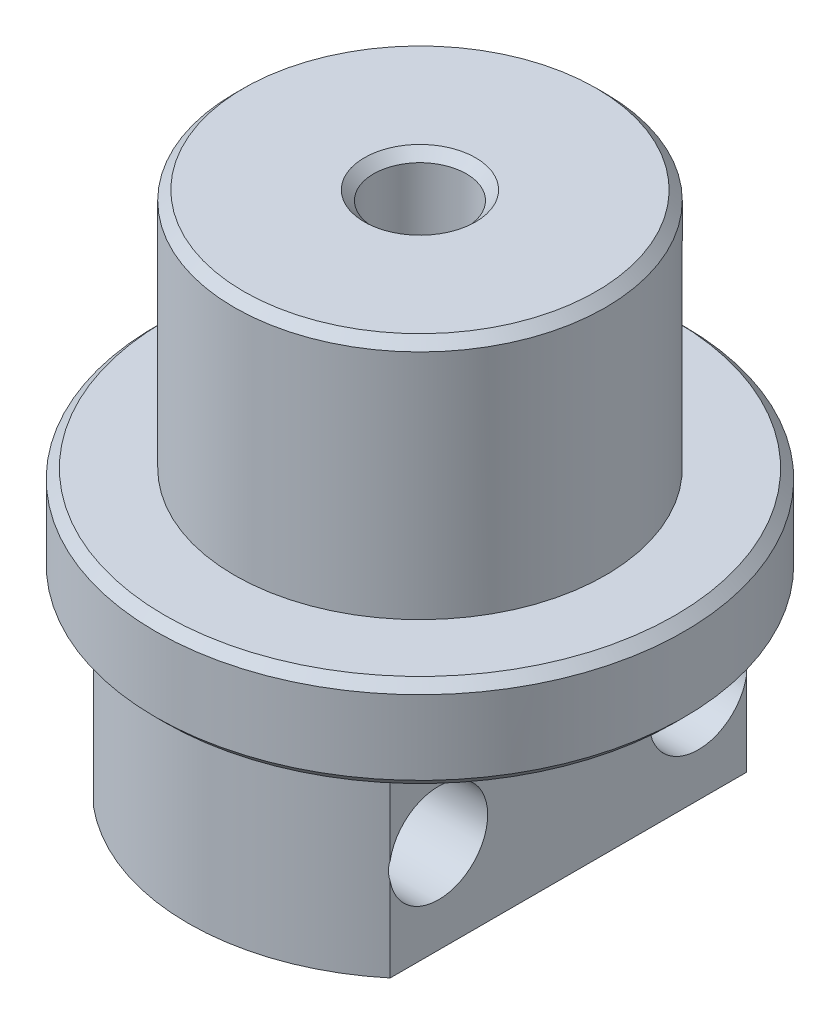
ISO-10303-21;
HEADER;
FILE_DESCRIPTION(('STEP AP214'),'2;1');
FILE_NAME('part.step','',(''),(''),'','','');
FILE_SCHEMA(('AUTOMOTIVE_DESIGN { 1 0 10303 214 1 1 1 1 }'));
ENDSEC;
DATA;
#1=APPLICATION_CONTEXT('core data for automotive mechanical design processes');
#2=APPLICATION_PROTOCOL_DEFINITION('international standard','automotive_design',2000,#1);
#3=PRODUCT_CONTEXT('',#1,'mechanical');
#4=PRODUCT('Part','Part','',(#3));
#5=PRODUCT_RELATED_PRODUCT_CATEGORY('part','',(#4));
#6=PRODUCT_DEFINITION_FORMATION('','',#4);
#7=PRODUCT_DEFINITION_CONTEXT('part definition',#1,'design');
#8=PRODUCT_DEFINITION('design','',#6,#7);
#9=PRODUCT_DEFINITION_SHAPE('','',#8);
#10=(LENGTH_UNIT() NAMED_UNIT(*) SI_UNIT(.MILLI.,.METRE.));
#11=(NAMED_UNIT(*) PLANE_ANGLE_UNIT() SI_UNIT($,.RADIAN.));
#12=(NAMED_UNIT(*) SI_UNIT($,.STERADIAN.) SOLID_ANGLE_UNIT());
#13=UNCERTAINTY_MEASURE_WITH_UNIT(LENGTH_MEASURE(1.E-05),#10,'distance_accuracy_value','');
#14=(GEOMETRIC_REPRESENTATION_CONTEXT(3) GLOBAL_UNCERTAINTY_ASSIGNED_CONTEXT((#13)) GLOBAL_UNIT_ASSIGNED_CONTEXT((#10,
#11,#12)) REPRESENTATION_CONTEXT('',''));
#15=CARTESIAN_POINT('',(0.,0.,0.));
#16=DIRECTION('',(0.,0.,1.));
#17=DIRECTION('',(1.,0.,0.));
#18=AXIS2_PLACEMENT_3D('',#15,#16,#17);
#19=CARTESIAN_POINT('',(0.,0.,0.));
#20=DIRECTION('',(0.,1.,0.));
#21=DIRECTION('',(0.,0.,1.));
#22=AXIS2_PLACEMENT_3D('',#19,#20,#21);
#23=CYLINDRICAL_SURFACE('',#22,12.5);
#24=DIRECTION('',(0.,-1.,0.));
#25=VECTOR('',#24,1.);
#26=CARTESIAN_POINT('',(7.99999999999995,29.729419656949,9.60468635614932));
#27=LINE('',#26,#25);
#28=CARTESIAN_POINT('',(7.99999999999995,4.51203587610476,9.60468635614932));
#29=VERTEX_POINT('',#28);
#30=CARTESIAN_POINT('',(7.99999999999995,0.,9.60468635614932));
#31=VERTEX_POINT('',#30);
#32=EDGE_CURVE('E248',#29,#31,#27,.T.);
#33=ORIENTED_EDGE('',*,*,#32,.F.);
#34=CARTESIAN_POINT('',(7.99999999999995,4.51203587610476,9.60468635614932));
#35=CARTESIAN_POINT('',(7.98932552687652,4.55943695181005,9.61357515241068));
#36=CARTESIAN_POINT('',(7.98011875165914,4.60741608335441,9.62121570568237));
#37=CARTESIAN_POINT('',(7.96481090833997,4.70423038441509,9.63389318043032));
#38=CARTESIAN_POINT('',(7.95871144080061,4.75306598172428,9.63892876011513));
#39=CARTESIAN_POINT('',(7.94990704324458,4.85006296771122,9.64619136002725));
#40=CARTESIAN_POINT('',(7.94712399407921,4.89821231990115,9.64848302052576));
#41=CARTESIAN_POINT('',(7.94475527570194,4.99461847220165,9.65043335545134));
#42=CARTESIAN_POINT('',(7.94516816785371,5.04287521419252,9.65009321457012));
#43=CARTESIAN_POINT('',(7.94996438221906,5.15763425320831,9.64614399084281));
#44=CARTESIAN_POINT('',(7.9558090875406,5.22403932634691,9.64133174835942));
#45=CARTESIAN_POINT('',(7.97343161448776,5.35667710055973,9.62675816973986));
#46=CARTESIAN_POINT('',(7.98530879648151,5.42288760112959,9.61691393410233));
#47=CARTESIAN_POINT('',(7.99999999999994,5.48796412389522,9.60468635614932));
#48=B_SPLINE_CURVE_WITH_KNOTS('',3,(#34,#35,#36,#37,#38,#39,#40,#41,#42,#43,#44,#45,#46,#47),
.UNSPECIFIED.,.F.,.F.,(4,2,2,2,2,2,4),(0.,0.148162666375663,0.296401573810314,0.441074930711813,
0.585683167443805,0.785726822426951,0.989177726164951),.UNSPECIFIED.);
#49=CARTESIAN_POINT('',(7.99999999999995,5.48796412389522,9.60468635614932));
#50=VERTEX_POINT('',#49);
#51=EDGE_CURVE('E103',#29,#50,#48,.T.);
#52=ORIENTED_EDGE('',*,*,#51,.T.);
#53=CARTESIAN_POINT('',(7.99999999999995,10.,9.60468635614932));
#54=VERTEX_POINT('',#53);
#55=EDGE_CURVE('E133',#54,#50,#27,.T.);
#56=ORIENTED_EDGE('',*,*,#55,.F.);
#57=CARTESIAN_POINT('',(0.,10.,0.));
#58=DIRECTION('',(0.,1.,0.));
#59=DIRECTION('',(0.,0.,1.));
#60=AXIS2_PLACEMENT_3D('',#57,#58,#59);
#61=CIRCLE('',#60,12.5);
#62=CARTESIAN_POINT('',(-7.99999999999995,10.,9.60468635614932));
#63=VERTEX_POINT('',#62);
#64=EDGE_CURVE('E118',#63,#54,#61,.T.);
#65=ORIENTED_EDGE('',*,*,#64,.F.);
#66=DIRECTION('',(0.,-1.,0.));
#67=VECTOR('',#66,1.);
#68=CARTESIAN_POINT('',(-7.99999999999995,29.729419656949,9.60468635614932));
#69=LINE('',#68,#67);
#70=CARTESIAN_POINT('',(-7.99999999999995,5.48796412408287,9.60468635614932));
#71=VERTEX_POINT('',#70);
#72=EDGE_CURVE('E108',#63,#71,#69,.T.);
#73=ORIENTED_EDGE('',*,*,#72,.T.);
#74=CARTESIAN_POINT('',(-7.99999999999995,5.48796412408287,9.60468635614932));
#75=CARTESIAN_POINT('',(-7.98932552687238,5.44056304837779,9.61357515241412));
#76=CARTESIAN_POINT('',(-7.98011875165078,5.39258391683344,9.62121570568931));
#77=CARTESIAN_POINT('',(-7.96481090832309,5.29576961577231,9.63389318044429));
#78=CARTESIAN_POINT('',(-7.95871144077943,5.24693401846268,9.63892876013262));
#79=CARTESIAN_POINT('',(-7.94990704321498,5.14993703247484,9.64619136005164));
#80=CARTESIAN_POINT('',(-7.94712399404546,5.10178768028448,9.64848302055356));
#81=CARTESIAN_POINT('',(-7.94475527565997,5.00538152798265,9.65043335548589));
#82=CARTESIAN_POINT('',(-7.94516816780767,4.95712478599088,9.65009321460802));
#83=CARTESIAN_POINT('',(-7.94996438216611,4.84236574691198,9.64614399088645));
#84=CARTESIAN_POINT('',(-7.95580908749047,4.77596067371131,9.64133174840081));
#85=CARTESIAN_POINT('',(-7.97343161445428,4.64332289937422,9.6267581697676));
#86=CARTESIAN_POINT('',(-7.98530879646218,4.57711239874224,9.61691393411841));
#87=CARTESIAN_POINT('',(-7.99999999999995,4.51203587591711,9.60468635614932));
#88=B_SPLINE_CURVE_WITH_KNOTS('',3,(#74,#75,#76,#77,#78,#79,#80,#81,#82,#83,#84,#85,#86,#87),
.UNSPECIFIED.,.F.,.F.,(4,2,2,2,2,2,4),(0.,0.148162666379635,0.296401573818273,0.441074930722263,
0.585683167456781,0.785726822624845,0.989177726555372),.UNSPECIFIED.);
#89=CARTESIAN_POINT('',(-7.99999999999995,4.51203587591714,9.60468635614932));
#90=VERTEX_POINT('',#89);
#91=EDGE_CURVE('E98',#71,#90,#88,.T.);
#92=ORIENTED_EDGE('',*,*,#91,.T.);
#93=CARTESIAN_POINT('',(-7.99999999999995,0.,9.60468635614932));
#94=VERTEX_POINT('',#93);
#95=EDGE_CURVE('E111',#90,#94,#69,.T.);
#96=ORIENTED_EDGE('',*,*,#95,.T.);
#97=CARTESIAN_POINT('',(0.,0.,0.));
#98=DIRECTION('',(0.,1.,0.));
#99=DIRECTION('',(0.,0.,1.));
#100=AXIS2_PLACEMENT_3D('',#97,#98,#99);
#101=CIRCLE('',#100,12.5);
#102=EDGE_CURVE('E129',#94,#31,#101,.T.);
#103=ORIENTED_EDGE('',*,*,#102,.T.);
#104=EDGE_LOOP('',(#33,#52,#56,#65,#73,#92,#96,#103));
#105=FACE_BOUND('',#104,.T.);
#106=ADVANCED_FACE('F35',(#105),#23,.T.);
#107=CARTESIAN_POINT('',(12.5,0.,0.));
#108=DIRECTION('',(0.,1.,0.));
#109=DIRECTION('',(0.,0.,1.));
#110=AXIS2_PLACEMENT_3D('',#107,#108,#109);
#111=PLANE('',#110);
#112=CARTESIAN_POINT('',(0.,0.,0.));
#113=DIRECTION('',(0.,1.,0.));
#114=DIRECTION('',(0.,0.,1.));
#115=AXIS2_PLACEMENT_3D('',#112,#113,#114);
#116=CIRCLE('',#115,2.49999999999999);
#117=CARTESIAN_POINT('',(0.,0.,2.49999999999999));
#118=VERTEX_POINT('',#117);
#119=EDGE_CURVE('E112',#118,#118,#116,.T.);
#120=ORIENTED_EDGE('',*,*,#119,.T.);
#121=EDGE_LOOP('',(#120));
#122=FACE_BOUND('',#121,.T.);
#123=CARTESIAN_POINT('',(7.99999999999995,0.,-9.60468635614932));
#124=VERTEX_POINT('',#123);
#125=CARTESIAN_POINT('',(-7.99999999999995,0.,-9.60468635614932));
#126=VERTEX_POINT('',#125);
#127=EDGE_CURVE('E132',#124,#126,#101,.T.);
#128=ORIENTED_EDGE('',*,*,#127,.F.);
#129=DIRECTION('',(0.,0.,-1.));
#130=VECTOR('',#129,1.);
#131=CARTESIAN_POINT('',(7.99999999999995,0.,9.60468635614932));
#132=LINE('',#131,#130);
#133=EDGE_CURVE('E128',#31,#124,#132,.T.);
#134=ORIENTED_EDGE('',*,*,#133,.F.);
#135=ORIENTED_EDGE('',*,*,#102,.F.);
#136=DIRECTION('',(0.,0.,1.));
#137=VECTOR('',#136,1.);
#138=CARTESIAN_POINT('',(-7.99999999999995,0.,9.60468635614932));
#139=LINE('',#138,#137);
#140=EDGE_CURVE('E255',#126,#94,#139,.T.);
#141=ORIENTED_EDGE('',*,*,#140,.F.);
#142=EDGE_LOOP('',(#128,#134,#135,#141));
#143=FACE_BOUND('',#142,.T.);
#144=ADVANCED_FACE('F175',(#122,#143),#111,.F.);
#145=CARTESIAN_POINT('',(0.,28.,0.));
#146=DIRECTION('',(0.,-1.,0.));
#147=DIRECTION('',(0.,0.,-1.));
#148=AXIS2_PLACEMENT_3D('',#145,#146,#147);
#149=PLANE('',#148);
#150=CARTESIAN_POINT('',(0.,28.,0.));
#151=DIRECTION('',(0.,-1.,0.));
#152=DIRECTION('',(0.,0.,-1.));
#153=AXIS2_PLACEMENT_3D('',#150,#151,#152);
#154=CIRCLE('',#153,9.49999999999998);
#155=CARTESIAN_POINT('',(0.,28.,-9.49999999999998));
#156=VERTEX_POINT('',#155);
#157=EDGE_CURVE('E221',#156,#156,#154,.F.);
#158=ORIENTED_EDGE('',*,*,#157,.T.);
#159=EDGE_LOOP('',(#158));
#160=FACE_BOUND('',#159,.T.);
#161=CARTESIAN_POINT('',(0.,28.,0.));
#162=DIRECTION('',(0.,-1.,0.));
#163=DIRECTION('',(0.,0.,-1.));
#164=AXIS2_PLACEMENT_3D('',#161,#162,#163);
#165=CIRCLE('',#164,3.);
#166=CARTESIAN_POINT('',(0.,28.,-3.));
#167=VERTEX_POINT('',#166);
#168=EDGE_CURVE('E222',#167,#167,#165,.T.);
#169=ORIENTED_EDGE('',*,*,#168,.T.);
#170=EDGE_LOOP('',(#169));
#171=FACE_BOUND('',#170,.T.);
#172=ADVANCED_FACE('F179',(#160,#171),#149,.F.);
#173=CARTESIAN_POINT('',(0.,0.,0.));
#174=DIRECTION('',(0.,1.,0.));
#175=DIRECTION('',(0.,0.,1.));
#176=AXIS2_PLACEMENT_3D('',#173,#174,#175);
#177=CYLINDRICAL_SURFACE('',#176,10.);
#178=CARTESIAN_POINT('',(0.,27.5,0.));
#179=DIRECTION('',(0.,-1.,0.));
#180=DIRECTION('',(0.,0.,-1.));
#181=AXIS2_PLACEMENT_3D('',#178,#179,#180);
#182=CIRCLE('',#181,10.);
#183=CARTESIAN_POINT('',(0.,27.5,-10.));
#184=VERTEX_POINT('',#183);
#185=EDGE_CURVE('E44',#184,#184,#182,.T.);
#186=ORIENTED_EDGE('',*,*,#185,.T.);
#187=EDGE_LOOP('',(#186));
#188=FACE_BOUND('',#187,.T.);
#189=CARTESIAN_POINT('',(0.,15.,0.));
#190=DIRECTION('',(0.,1.,0.));
#191=DIRECTION('',(0.,0.,1.));
#192=AXIS2_PLACEMENT_3D('',#189,#190,#191);
#193=CIRCLE('',#192,10.);
#194=CARTESIAN_POINT('',(0.,15.,10.));
#195=VERTEX_POINT('',#194);
#196=EDGE_CURVE('E136',#195,#195,#193,.T.);
#197=ORIENTED_EDGE('',*,*,#196,.T.);
#198=EDGE_LOOP('',(#197));
#199=FACE_BOUND('',#198,.T.);
#200=ADVANCED_FACE('F185',(#188,#199),#177,.T.);
#201=CARTESIAN_POINT('',(10.,15.,0.));
#202=DIRECTION('',(0.,-1.,0.));
#203=DIRECTION('',(0.,0.,-1.));
#204=AXIS2_PLACEMENT_3D('',#201,#202,#203);
#205=PLANE('',#204);
#206=CARTESIAN_POINT('',(0.,15.,0.));
#207=DIRECTION('',(0.,-1.,0.));
#208=DIRECTION('',(0.,0.,-1.));
#209=AXIS2_PLACEMENT_3D('',#206,#207,#208);
#210=CIRCLE('',#209,13.75);
#211=CARTESIAN_POINT('',(0.,15.,-13.75));
#212=VERTEX_POINT('',#211);
#213=EDGE_CURVE('E225',#212,#212,#210,.F.);
#214=ORIENTED_EDGE('',*,*,#213,.T.);
#215=EDGE_LOOP('',(#214));
#216=FACE_BOUND('',#215,.T.);
#217=ORIENTED_EDGE('',*,*,#196,.F.);
#218=EDGE_LOOP('',(#217));
#219=FACE_BOUND('',#218,.T.);
#220=ADVANCED_FACE('F284',(#216,#219),#205,.F.);
#221=CARTESIAN_POINT('',(0.,0.,0.));
#222=DIRECTION('',(0.,1.,0.));
#223=DIRECTION('',(0.,0.,1.));
#224=AXIS2_PLACEMENT_3D('',#221,#222,#223);
#225=CYLINDRICAL_SURFACE('',#224,14.25);
#226=CARTESIAN_POINT('',(0.,10.5,0.));
#227=DIRECTION('',(0.,1.,0.));
#228=DIRECTION('',(0.,0.,1.));
#229=AXIS2_PLACEMENT_3D('',#226,#227,#228);
#230=CIRCLE('',#229,14.25);
#231=CARTESIAN_POINT('',(0.,10.5,14.25));
#232=VERTEX_POINT('',#231);
#233=EDGE_CURVE('E233',#232,#232,#230,.T.);
#234=ORIENTED_EDGE('',*,*,#233,.T.);
#235=EDGE_LOOP('',(#234));
#236=FACE_BOUND('',#235,.T.);
#237=CARTESIAN_POINT('',(0.,14.5,0.));
#238=DIRECTION('',(0.,-1.,0.));
#239=DIRECTION('',(0.,0.,-1.));
#240=AXIS2_PLACEMENT_3D('',#237,#238,#239);
#241=CIRCLE('',#240,14.25);
#242=CARTESIAN_POINT('',(0.,14.5,-14.25));
#243=VERTEX_POINT('',#242);
#244=EDGE_CURVE('E236',#243,#243,#241,.T.);
#245=ORIENTED_EDGE('',*,*,#244,.T.);
#246=EDGE_LOOP('',(#245));
#247=FACE_BOUND('',#246,.T.);
#248=ADVANCED_FACE('F279',(#236,#247),#225,.T.);
#249=CARTESIAN_POINT('',(14.25,10.,0.));
#250=DIRECTION('',(0.,1.,0.));
#251=DIRECTION('',(0.,0.,1.));
#252=AXIS2_PLACEMENT_3D('',#249,#250,#251);
#253=PLANE('',#252);
#254=CARTESIAN_POINT('',(0.,10.,0.));
#255=DIRECTION('',(0.,1.,0.));
#256=DIRECTION('',(0.,0.,1.));
#257=AXIS2_PLACEMENT_3D('',#254,#255,#256);
#258=CIRCLE('',#257,13.75);
#259=CARTESIAN_POINT('',(0.,10.,13.75));
#260=VERTEX_POINT('',#259);
#261=EDGE_CURVE('E230',#260,#260,#258,.F.);
#262=ORIENTED_EDGE('',*,*,#261,.T.);
#263=EDGE_LOOP('',(#262));
#264=FACE_BOUND('',#263,.T.);
#265=ORIENTED_EDGE('',*,*,#64,.T.);
#266=DIRECTION('',(0.,0.,-1.));
#267=VECTOR('',#266,1.);
#268=CARTESIAN_POINT('',(7.99999999999995,10.,9.60468635614932));
#269=LINE('',#268,#267);
#270=CARTESIAN_POINT('',(7.99999999999995,10.,-9.60468635614932));
#271=VERTEX_POINT('',#270);
#272=EDGE_CURVE('E250',#54,#271,#269,.T.);
#273=ORIENTED_EDGE('',*,*,#272,.T.);
#274=CARTESIAN_POINT('',(-7.99999999999995,10.,-9.60468635614932));
#275=VERTEX_POINT('',#274);
#276=EDGE_CURVE('E135',#271,#275,#61,.T.);
#277=ORIENTED_EDGE('',*,*,#276,.T.);
#278=DIRECTION('',(0.,0.,1.));
#279=VECTOR('',#278,1.);
#280=CARTESIAN_POINT('',(-7.99999999999995,10.,9.60468635614932));
#281=LINE('',#280,#279);
#282=EDGE_CURVE('E123',#275,#63,#281,.T.);
#283=ORIENTED_EDGE('',*,*,#282,.T.);
#284=EDGE_LOOP('',(#265,#273,#277,#283));
#285=FACE_BOUND('',#284,.T.);
#286=ADVANCED_FACE('F172',(#264,#285),#253,.F.);
#287=DIRECTION('',(0.,-1.,0.));
#288=VECTOR('',#287,1.);
#289=CARTESIAN_POINT('',(-7.99999999999995,29.729419656949,-9.60468635614932));
#290=LINE('',#289,#288);
#291=CARTESIAN_POINT('',(-7.99999999999994,4.51203587653688,-9.60468635614932));
#292=VERTEX_POINT('',#291);
#293=EDGE_CURVE('E119',#292,#126,#290,.T.);
#294=ORIENTED_EDGE('',*,*,#293,.F.);
#295=CARTESIAN_POINT('',(-7.99999999999994,4.51203587653688,-9.60468635614932));
#296=CARTESIAN_POINT('',(-7.98932552688604,4.5594369522432,-9.61357515240274));
#297=CARTESIAN_POINT('',(-7.98011875167843,4.60741608378813,-9.62121570566637));
#298=CARTESIAN_POINT('',(-7.96481090837897,4.70423038484894,-9.63389318039807));
#299=CARTESIAN_POINT('',(-7.95871144084956,4.75306598215767,-9.6389287600747));
#300=CARTESIAN_POINT('',(-7.94990704331306,4.85006296814368,-9.6461913599708));
#301=CARTESIAN_POINT('',(-7.94712399415734,4.89821232033317,-9.6484830204614));
#302=CARTESIAN_POINT('',(-7.94475527579924,4.99461847263171,-9.65043335537124));
#303=CARTESIAN_POINT('',(-7.94516816796052,5.04287521462108,-9.65009321448219));
#304=CARTESIAN_POINT('',(-7.94996438234205,5.15763425349094,-9.64614399074144));
#305=CARTESIAN_POINT('',(-7.95580908765709,5.22403932648547,-9.64133174826324));
#306=CARTESIAN_POINT('',(-7.9734316145656,5.35667710040988,-9.62675816967538));
#307=CARTESIAN_POINT('',(-7.98530879652648,5.42288760083554,-9.61691393406497));
#308=CARTESIAN_POINT('',(-7.99999999999994,5.48796412346313,-9.60468635614932));
#309=B_SPLINE_CURVE_WITH_KNOTS('',3,(#295,#296,#297,#298,#299,#300,#301,#302,#303,#304,#305,
#306,#307,#308),.UNSPECIFIED.,.F.,.F.,(4,2,2,2,2,2,4),(0.,0.148162666368151,0.296401573795262,
0.441074930692675,0.585683167420496,0.785726821974484,0.989177725265608),.UNSPECIFIED.);
#310=CARTESIAN_POINT('',(-7.99999999999995,5.48796412346314,-9.60468635614932));
#311=VERTEX_POINT('',#310);
#312=EDGE_CURVE('E104',#292,#311,#309,.T.);
#313=ORIENTED_EDGE('',*,*,#312,.T.);
#314=EDGE_CURVE('E121',#275,#311,#290,.T.);
#315=ORIENTED_EDGE('',*,*,#314,.F.);
#316=ORIENTED_EDGE('',*,*,#276,.F.);
#317=DIRECTION('',(0.,-1.,0.));
#318=VECTOR('',#317,1.);
#319=CARTESIAN_POINT('',(7.99999999999995,29.729419656949,-9.60468635614932));
#320=LINE('',#319,#318);
#321=CARTESIAN_POINT('',(7.99999999999994,5.48796412365077,-9.60468635614932));
#322=VERTEX_POINT('',#321);
#323=EDGE_CURVE('E252',#271,#322,#320,.T.);
#324=ORIENTED_EDGE('',*,*,#323,.T.);
#325=CARTESIAN_POINT('',(7.99999999999994,5.48796412365077,-9.60468635614932));
#326=CARTESIAN_POINT('',(7.9893255268819,5.44056304794465,-9.61357515240619));
#327=CARTESIAN_POINT('',(7.98011875167006,5.39258391639972,-9.62121570567331));
#328=CARTESIAN_POINT('',(7.96481090836209,5.29576961533847,-9.63389318041204));
#329=CARTESIAN_POINT('',(7.95871144082839,5.2469340180293,-9.63892876009219));
#330=CARTESIAN_POINT('',(7.94990704328347,5.14993703204239,-9.64619135999519));
#331=CARTESIAN_POINT('',(7.94712399412359,5.10178767985247,-9.6484830204892));
#332=CARTESIAN_POINT('',(7.94475527575727,5.0053815275526,-9.65043335540579));
#333=CARTESIAN_POINT('',(7.94516816791448,4.95712478556234,-9.65009321452009));
#334=CARTESIAN_POINT('',(7.9499643822891,4.84236574662936,-9.64614399078508));
#335=CARTESIAN_POINT('',(7.95580908760696,4.77596067357276,-9.64133174830463));
#336=CARTESIAN_POINT('',(7.97343161453212,4.6433228995241,-9.62675816970312));
#337=CARTESIAN_POINT('',(7.98530879650714,4.57711239903631,-9.61691393408104));
#338=CARTESIAN_POINT('',(7.99999999999994,4.51203587634924,-9.60468635614932));
#339=B_SPLINE_CURVE_WITH_KNOTS('',3,(#325,#326,#327,#328,#329,#330,#331,#332,#333,#334,#335,
#336,#337,#338),.UNSPECIFIED.,.F.,.F.,(4,2,2,2,2,2,4),(0.,0.148162666372123,0.296401573803219,
0.441074930703122,0.58568316743347,0.785726822172366,0.989177725656006),.UNSPECIFIED.);
#340=CARTESIAN_POINT('',(7.99999999999995,4.51203587634924,-9.60468635614932));
#341=VERTEX_POINT('',#340);
#342=EDGE_CURVE('E139',#322,#341,#339,.T.);
#343=ORIENTED_EDGE('',*,*,#342,.T.);
#344=EDGE_CURVE('E268',#341,#124,#320,.T.);
#345=ORIENTED_EDGE('',*,*,#344,.T.);
#346=ORIENTED_EDGE('',*,*,#127,.T.);
#347=EDGE_LOOP('',(#294,#313,#315,#316,#324,#343,#345,#346));
#348=FACE_BOUND('',#347,.T.);
#349=ADVANCED_FACE('F152',(#348),#23,.T.);
#350=CARTESIAN_POINT('',(-7.99999999999995,29.729419656949,9.60468635614932));
#351=DIRECTION('',(1.,0.,0.));
#352=DIRECTION('',(0.,0.,-1.));
#353=AXIS2_PLACEMENT_3D('',#350,#351,#352);
#354=PLANE('',#353);
#355=ORIENTED_EDGE('',*,*,#95,.F.);
#356=CARTESIAN_POINT('',(-7.99999999999995,4.99999999999999,7.00000000005805));
#357=DIRECTION('',(1.,0.,0.));
#358=DIRECTION('',(0.,0.,-1.));
#359=AXIS2_PLACEMENT_3D('',#356,#357,#358);
#360=CIRCLE('',#359,2.64999999999999);
#361=EDGE_CURVE('E50',#90,#71,#360,.T.);
#362=ORIENTED_EDGE('',*,*,#361,.T.);
#363=ORIENTED_EDGE('',*,*,#72,.F.);
#364=ORIENTED_EDGE('',*,*,#282,.F.);
#365=ORIENTED_EDGE('',*,*,#314,.T.);
#366=CARTESIAN_POINT('',(-7.99999999999994,5.,-6.99999999994196));
#367=DIRECTION('',(1.,0.,0.));
#368=DIRECTION('',(0.,0.,-1.));
#369=AXIS2_PLACEMENT_3D('',#366,#367,#368);
#370=CIRCLE('',#369,2.64999999999999);
#371=EDGE_CURVE('E256',#311,#292,#370,.T.);
#372=ORIENTED_EDGE('',*,*,#371,.T.);
#373=ORIENTED_EDGE('',*,*,#293,.T.);
#374=ORIENTED_EDGE('',*,*,#140,.T.);
#375=EDGE_LOOP('',(#355,#362,#363,#364,#365,#372,#373,#374));
#376=FACE_BOUND('',#375,.T.);
#377=ADVANCED_FACE('F107',(#376),#354,.F.);
#378=CARTESIAN_POINT('',(7.99999999999995,29.729419656949,9.60468635614932));
#379=DIRECTION('',(-1.,0.,0.));
#380=DIRECTION('',(0.,0.,1.));
#381=AXIS2_PLACEMENT_3D('',#378,#379,#380);
#382=PLANE('',#381);
#383=ORIENTED_EDGE('',*,*,#55,.T.);
#384=CARTESIAN_POINT('',(7.99999999999995,4.99999999999999,7.0000000000229));
#385=DIRECTION('',(-1.,0.,0.));
#386=DIRECTION('',(0.,0.,1.));
#387=AXIS2_PLACEMENT_3D('',#384,#385,#386);
#388=CIRCLE('',#387,2.64999999999999);
#389=EDGE_CURVE('E57',#50,#29,#388,.T.);
#390=ORIENTED_EDGE('',*,*,#389,.T.);
#391=ORIENTED_EDGE('',*,*,#32,.T.);
#392=ORIENTED_EDGE('',*,*,#133,.T.);
#393=ORIENTED_EDGE('',*,*,#344,.F.);
#394=CARTESIAN_POINT('',(7.99999999999994,5.,-6.99999999997711));
#395=DIRECTION('',(-1.,0.,0.));
#396=DIRECTION('',(0.,0.,1.));
#397=AXIS2_PLACEMENT_3D('',#394,#395,#396);
#398=CIRCLE('',#397,2.64999999999999);
#399=EDGE_CURVE('E260',#341,#322,#398,.T.);
#400=ORIENTED_EDGE('',*,*,#399,.T.);
#401=ORIENTED_EDGE('',*,*,#323,.F.);
#402=ORIENTED_EDGE('',*,*,#272,.F.);
#403=EDGE_LOOP('',(#383,#390,#391,#392,#393,#400,#401,#402));
#404=FACE_BOUND('',#403,.T.);
#405=ADVANCED_FACE('F161',(#404),#382,.F.);
#406=CARTESIAN_POINT('',(24.499999999953,5.,-7.00000000001336));
#407=DIRECTION('',(1.,0.,-2.19690324959609E-12));
#408=DIRECTION('',(-2.19690324959609E-12,0.,-1.));
#409=AXIS2_PLACEMENT_3D('',#406,#407,#408);
#410=CYLINDRICAL_SURFACE('',#409,2.64999999999999);
#411=ORIENTED_EDGE('',*,*,#342,.F.);
#412=ORIENTED_EDGE('',*,*,#399,.F.);
#413=EDGE_LOOP('',(#411,#412));
#414=FACE_BOUND('',#413,.T.);
#415=ORIENTED_EDGE('',*,*,#312,.F.);
#416=ORIENTED_EDGE('',*,*,#371,.F.);
#417=EDGE_LOOP('',(#415,#416));
#418=FACE_BOUND('',#417,.T.);
#419=ADVANCED_FACE('F156',(#414,#418),#410,.F.);
#420=CARTESIAN_POINT('',(24.4999999999837,4.99999999999999,6.99999999998666));
#421=DIRECTION('',(1.,0.,-2.19690324959609E-12));
#422=DIRECTION('',(-2.19690324959609E-12,0.,-1.));
#423=AXIS2_PLACEMENT_3D('',#420,#421,#422);
#424=CYLINDRICAL_SURFACE('',#423,2.64999999999999);
#425=ORIENTED_EDGE('',*,*,#91,.F.);
#426=ORIENTED_EDGE('',*,*,#361,.F.);
#427=EDGE_LOOP('',(#425,#426));
#428=FACE_BOUND('',#427,.T.);
#429=ORIENTED_EDGE('',*,*,#51,.F.);
#430=ORIENTED_EDGE('',*,*,#389,.F.);
#431=EDGE_LOOP('',(#429,#430));
#432=FACE_BOUND('',#431,.T.);
#433=ADVANCED_FACE('F99',(#428,#432),#424,.F.);
#434=CARTESIAN_POINT('',(0.,28.,0.));
#435=DIRECTION('',(0.,1.,0.));
#436=DIRECTION('',(0.,0.,1.));
#437=AXIS2_PLACEMENT_3D('',#434,#435,#436);
#438=CYLINDRICAL_SURFACE('',#437,2.49999999999999);
#439=CARTESIAN_POINT('',(0.,27.5,0.));
#440=DIRECTION('',(0.,-1.,0.));
#441=DIRECTION('',(0.,0.,-1.));
#442=AXIS2_PLACEMENT_3D('',#439,#440,#441);
#443=CIRCLE('',#442,2.49999999999999);
#444=CARTESIAN_POINT('',(0.,27.5,-2.49999999999999));
#445=VERTEX_POINT('',#444);
#446=EDGE_CURVE('E11',#445,#445,#443,.F.);
#447=ORIENTED_EDGE('',*,*,#446,.T.);
#448=EDGE_LOOP('',(#447));
#449=FACE_BOUND('',#448,.T.);
#450=ORIENTED_EDGE('',*,*,#119,.F.);
#451=EDGE_LOOP('',(#450));
#452=FACE_BOUND('',#451,.T.);
#453=ADVANCED_FACE('F200',(#449,#452),#438,.F.);
#454=CARTESIAN_POINT('',(0.,10.5,0.));
#455=DIRECTION('',(0.,1.,0.));
#456=DIRECTION('',(0.,0.,1.));
#457=AXIS2_PLACEMENT_3D('',#454,#455,#456);
#458=CONICAL_SURFACE('',#457,14.25,0.785398163397441);
#459=ORIENTED_EDGE('',*,*,#261,.F.);
#460=EDGE_LOOP('',(#459));
#461=FACE_BOUND('',#460,.T.);
#462=ORIENTED_EDGE('',*,*,#233,.F.);
#463=EDGE_LOOP('',(#462));
#464=FACE_BOUND('',#463,.T.);
#465=ADVANCED_FACE('F193',(#461,#464),#458,.T.);
#466=CARTESIAN_POINT('',(0.,15.,0.));
#467=DIRECTION('',(0.,-1.,0.));
#468=DIRECTION('',(0.,0.,-1.));
#469=AXIS2_PLACEMENT_3D('',#466,#467,#468);
#470=CONICAL_SURFACE('',#469,13.75,0.785398163397453);
#471=ORIENTED_EDGE('',*,*,#244,.F.);
#472=EDGE_LOOP('',(#471));
#473=FACE_BOUND('',#472,.T.);
#474=ORIENTED_EDGE('',*,*,#213,.F.);
#475=EDGE_LOOP('',(#474));
#476=FACE_BOUND('',#475,.T.);
#477=ADVANCED_FACE('F199',(#473,#476),#470,.T.);
#478=CARTESIAN_POINT('',(0.,28.,0.));
#479=DIRECTION('',(0.,-1.,0.));
#480=DIRECTION('',(0.,0.,-1.));
#481=AXIS2_PLACEMENT_3D('',#478,#479,#480);
#482=CONICAL_SURFACE('',#481,9.49999999999998,0.785398163397447);
#483=ORIENTED_EDGE('',*,*,#185,.F.);
#484=EDGE_LOOP('',(#483));
#485=FACE_BOUND('',#484,.T.);
#486=ORIENTED_EDGE('',*,*,#157,.F.);
#487=EDGE_LOOP('',(#486));
#488=FACE_BOUND('',#487,.T.);
#489=ADVANCED_FACE('F206',(#485,#488),#482,.T.);
#490=CARTESIAN_POINT('',(0.,27.5,0.));
#491=DIRECTION('',(0.,1.,0.));
#492=DIRECTION('',(0.,0.,1.));
#493=AXIS2_PLACEMENT_3D('',#490,#491,#492);
#494=CONICAL_SURFACE('',#493,2.49999999999999,0.785398163397449);
#495=ORIENTED_EDGE('',*,*,#168,.F.);
#496=EDGE_LOOP('',(#495));
#497=FACE_BOUND('',#496,.T.);
#498=ORIENTED_EDGE('',*,*,#446,.F.);
#499=EDGE_LOOP('',(#498));
#500=FACE_BOUND('',#499,.T.);
#501=ADVANCED_FACE('F38',(#497,#500),#494,.F.);
#502=CLOSED_SHELL('',(#106,#144,#172,#200,#220,#248,#286,#349,#377,#405,#419,#433,#453,#465,
#477,#489,#501));
#503=MANIFOLD_SOLID_BREP('B2',#502);
#504=ADVANCED_BREP_SHAPE_REPRESENTATION('',(#18,#503),#14);
#505=SHAPE_DEFINITION_REPRESENTATION(#9,#504);
ENDSEC;
END-ISO-10303-21;
